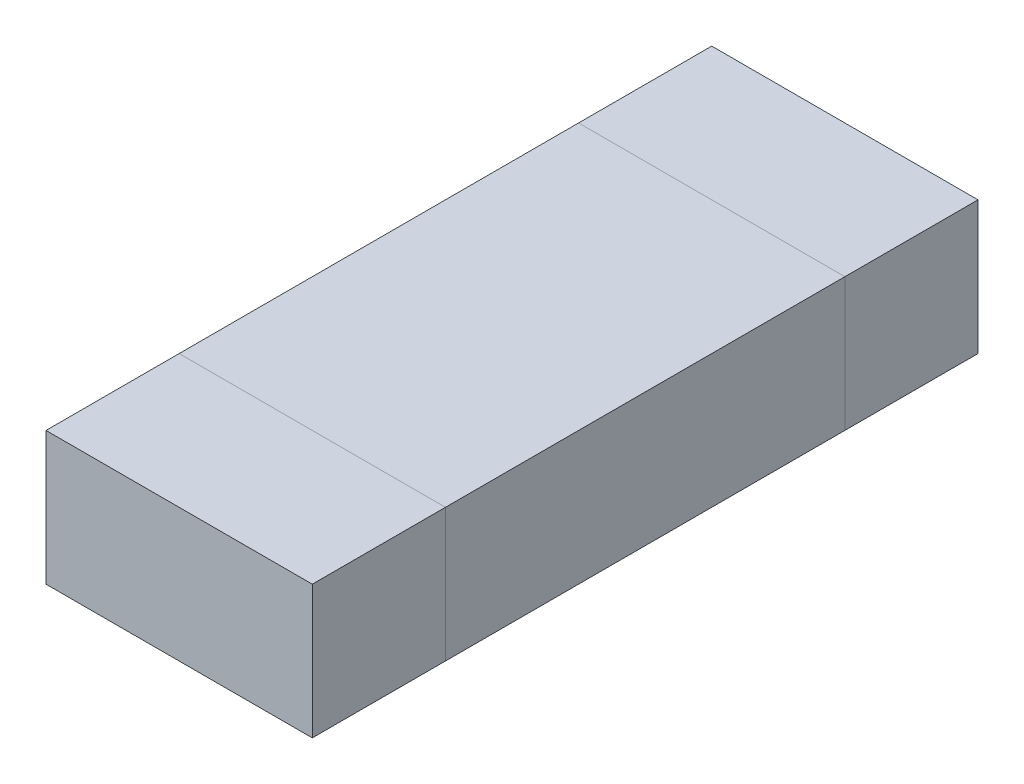
ISO-10303-21;
HEADER;
FILE_DESCRIPTION(('STEP AP214'),'2;1');
FILE_NAME('part.step','',(''),(''),'','','');
FILE_SCHEMA(('AUTOMOTIVE_DESIGN { 1 0 10303 214 1 1 1 1 }'));
ENDSEC;
DATA;
#1=APPLICATION_CONTEXT('core data for automotive mechanical design processes');
#2=APPLICATION_PROTOCOL_DEFINITION('international standard','automotive_design',2000,#1);
#3=PRODUCT_CONTEXT('',#1,'mechanical');
#4=PRODUCT('Part','Part','',(#3));
#5=PRODUCT_RELATED_PRODUCT_CATEGORY('part','',(#4));
#6=PRODUCT_DEFINITION_FORMATION('','',#4);
#7=PRODUCT_DEFINITION_CONTEXT('part definition',#1,'design');
#8=PRODUCT_DEFINITION('design','',#6,#7);
#9=PRODUCT_DEFINITION_SHAPE('','',#8);
#10=(LENGTH_UNIT() NAMED_UNIT(*) SI_UNIT(.MILLI.,.METRE.));
#11=(NAMED_UNIT(*) PLANE_ANGLE_UNIT() SI_UNIT($,.RADIAN.));
#12=(NAMED_UNIT(*) SI_UNIT($,.STERADIAN.) SOLID_ANGLE_UNIT());
#13=UNCERTAINTY_MEASURE_WITH_UNIT(LENGTH_MEASURE(1.E-05),#10,'distance_accuracy_value','');
#14=(GEOMETRIC_REPRESENTATION_CONTEXT(3) GLOBAL_UNCERTAINTY_ASSIGNED_CONTEXT((#13)) GLOBAL_UNIT_ASSIGNED_CONTEXT((#10,
#11,#12)) REPRESENTATION_CONTEXT('',''));
#15=CARTESIAN_POINT('',(0.,0.,0.));
#16=DIRECTION('',(0.,0.,1.));
#17=DIRECTION('',(1.,0.,0.));
#18=AXIS2_PLACEMENT_3D('',#15,#16,#17);
#19=CARTESIAN_POINT('',(0.4,0.4,-1.));
#20=DIRECTION('',(-1.,0.,0.));
#21=DIRECTION('',(0.,0.,1.));
#22=AXIS2_PLACEMENT_3D('',#19,#20,#21);
#23=PLANE('',#22);
#24=DIRECTION('',(0.,-1.,0.));
#25=VECTOR('',#24,1.);
#26=CARTESIAN_POINT('',(0.4,0.4,-0.6));
#27=LINE('',#26,#25);
#28=CARTESIAN_POINT('',(0.4,0.4,-0.6));
#29=VERTEX_POINT('',#28);
#30=CARTESIAN_POINT('',(0.4,0.,-0.6));
#31=VERTEX_POINT('',#30);
#32=EDGE_CURVE('E108',#29,#31,#27,.T.);
#33=ORIENTED_EDGE('',*,*,#32,.T.);
#34=DIRECTION('',(0.,0.,1.));
#35=VECTOR('',#34,1.);
#36=CARTESIAN_POINT('',(0.4,0.,-1.));
#37=LINE('',#36,#35);
#38=CARTESIAN_POINT('',(0.4,0.,-1.));
#39=VERTEX_POINT('',#38);
#40=EDGE_CURVE('E12',#39,#31,#37,.T.);
#41=ORIENTED_EDGE('',*,*,#40,.F.);
#42=DIRECTION('',(0.,-1.,0.));
#43=VECTOR('',#42,1.);
#44=CARTESIAN_POINT('',(0.4,0.4,-1.));
#45=LINE('',#44,#43);
#46=CARTESIAN_POINT('',(0.4,0.4,-1.));
#47=VERTEX_POINT('',#46);
#48=EDGE_CURVE('E96',#47,#39,#45,.T.);
#49=ORIENTED_EDGE('',*,*,#48,.F.);
#50=DIRECTION('',(0.,0.,1.));
#51=VECTOR('',#50,1.);
#52=CARTESIAN_POINT('',(0.4,0.4,-1.));
#53=LINE('',#52,#51);
#54=EDGE_CURVE('E104',#47,#29,#53,.T.);
#55=ORIENTED_EDGE('',*,*,#54,.T.);
#56=EDGE_LOOP('',(#33,#41,#49,#55));
#57=FACE_BOUND('',#56,.T.);
#58=ADVANCED_FACE('F45',(#57),#23,.F.);
#59=CARTESIAN_POINT('',(0.4,0.,-1.));
#60=DIRECTION('',(0.,1.,0.));
#61=DIRECTION('',(0.,0.,1.));
#62=AXIS2_PLACEMENT_3D('',#59,#60,#61);
#63=PLANE('',#62);
#64=DIRECTION('',(-1.,0.,0.));
#65=VECTOR('',#64,1.);
#66=CARTESIAN_POINT('',(0.4,0.,-0.6));
#67=LINE('',#66,#65);
#68=CARTESIAN_POINT('',(-0.4,0.,-0.6));
#69=VERTEX_POINT('',#68);
#70=EDGE_CURVE('E100',#31,#69,#67,.T.);
#71=ORIENTED_EDGE('',*,*,#70,.T.);
#72=DIRECTION('',(0.,0.,1.));
#73=VECTOR('',#72,1.);
#74=CARTESIAN_POINT('',(-0.4,0.,-1.));
#75=LINE('',#74,#73);
#76=CARTESIAN_POINT('',(-0.4,0.,-1.));
#77=VERTEX_POINT('',#76);
#78=EDGE_CURVE('E53',#77,#69,#75,.T.);
#79=ORIENTED_EDGE('',*,*,#78,.F.);
#80=DIRECTION('',(-1.,0.,0.));
#81=VECTOR('',#80,1.);
#82=CARTESIAN_POINT('',(0.4,0.,-1.));
#83=LINE('',#82,#81);
#84=EDGE_CURVE('E91',#39,#77,#83,.T.);
#85=ORIENTED_EDGE('',*,*,#84,.F.);
#86=ORIENTED_EDGE('',*,*,#40,.T.);
#87=EDGE_LOOP('',(#71,#79,#85,#86));
#88=FACE_BOUND('',#87,.T.);
#89=ADVANCED_FACE('F99',(#88),#63,.F.);
#90=CARTESIAN_POINT('',(-0.4,0.,-1.));
#91=DIRECTION('',(1.,0.,0.));
#92=DIRECTION('',(0.,0.,-1.));
#93=AXIS2_PLACEMENT_3D('',#90,#91,#92);
#94=PLANE('',#93);
#95=DIRECTION('',(0.,1.,0.));
#96=VECTOR('',#95,1.);
#97=CARTESIAN_POINT('',(-0.4,0.,-0.6));
#98=LINE('',#97,#96);
#99=CARTESIAN_POINT('',(-0.4,0.4,-0.6));
#100=VERTEX_POINT('',#99);
#101=EDGE_CURVE('E78',#69,#100,#98,.T.);
#102=ORIENTED_EDGE('',*,*,#101,.T.);
#103=DIRECTION('',(0.,0.,1.));
#104=VECTOR('',#103,1.);
#105=CARTESIAN_POINT('',(-0.4,0.4,-1.));
#106=LINE('',#105,#104);
#107=CARTESIAN_POINT('',(-0.4,0.4,-1.));
#108=VERTEX_POINT('',#107);
#109=EDGE_CURVE('E101',#108,#100,#106,.T.);
#110=ORIENTED_EDGE('',*,*,#109,.F.);
#111=DIRECTION('',(0.,1.,0.));
#112=VECTOR('',#111,1.);
#113=CARTESIAN_POINT('',(-0.4,0.,-1.));
#114=LINE('',#113,#112);
#115=EDGE_CURVE('E94',#77,#108,#114,.T.);
#116=ORIENTED_EDGE('',*,*,#115,.F.);
#117=ORIENTED_EDGE('',*,*,#78,.T.);
#118=EDGE_LOOP('',(#102,#110,#116,#117));
#119=FACE_BOUND('',#118,.T.);
#120=ADVANCED_FACE('F102',(#119),#94,.F.);
#121=CARTESIAN_POINT('',(-0.4,0.4,-1.));
#122=DIRECTION('',(0.,-1.,0.));
#123=DIRECTION('',(0.,0.,-1.));
#124=AXIS2_PLACEMENT_3D('',#121,#122,#123);
#125=PLANE('',#124);
#126=DIRECTION('',(1.,0.,0.));
#127=VECTOR('',#126,1.);
#128=CARTESIAN_POINT('',(-0.4,0.4,-0.6));
#129=LINE('',#128,#127);
#130=EDGE_CURVE('E84',#100,#29,#129,.T.);
#131=ORIENTED_EDGE('',*,*,#130,.T.);
#132=ORIENTED_EDGE('',*,*,#54,.F.);
#133=DIRECTION('',(1.,0.,0.));
#134=VECTOR('',#133,1.);
#135=CARTESIAN_POINT('',(-0.4,0.4,-1.));
#136=LINE('',#135,#134);
#137=EDGE_CURVE('E61',#108,#47,#136,.T.);
#138=ORIENTED_EDGE('',*,*,#137,.F.);
#139=ORIENTED_EDGE('',*,*,#109,.T.);
#140=EDGE_LOOP('',(#131,#132,#138,#139));
#141=FACE_BOUND('',#140,.T.);
#142=ADVANCED_FACE('F115',(#141),#125,.F.);
#143=CARTESIAN_POINT('',(0.,0.,-1.));
#144=DIRECTION('',(0.,0.,-1.));
#145=DIRECTION('',(-1.,0.,0.));
#146=AXIS2_PLACEMENT_3D('',#143,#144,#145);
#147=PLANE('',#146);
#148=ORIENTED_EDGE('',*,*,#48,.T.);
#149=ORIENTED_EDGE('',*,*,#84,.T.);
#150=ORIENTED_EDGE('',*,*,#115,.T.);
#151=ORIENTED_EDGE('',*,*,#137,.T.);
#152=EDGE_LOOP('',(#148,#149,#150,#151));
#153=FACE_BOUND('',#152,.T.);
#154=ADVANCED_FACE('F92',(#153),#147,.T.);
#155=CARTESIAN_POINT('',(0.,0.,-0.6));
#156=DIRECTION('',(0.,0.,-1.));
#157=DIRECTION('',(-1.,0.,0.));
#158=AXIS2_PLACEMENT_3D('',#155,#156,#157);
#159=PLANE('',#158);
#160=ORIENTED_EDGE('',*,*,#32,.F.);
#161=ORIENTED_EDGE('',*,*,#130,.F.);
#162=ORIENTED_EDGE('',*,*,#101,.F.);
#163=ORIENTED_EDGE('',*,*,#70,.F.);
#164=EDGE_LOOP('',(#160,#161,#162,#163));
#165=FACE_BOUND('',#164,.T.);
#166=ADVANCED_FACE('F118',(#165),#159,.F.);
#167=CLOSED_SHELL('',(#58,#89,#120,#142,#154,#166));
#168=MANIFOLD_SOLID_BREP('B2',#167);
#169=CARTESIAN_POINT('',(-0.4,0.4,1.));
#170=DIRECTION('',(1.,0.,0.));
#171=DIRECTION('',(0.,0.,-1.));
#172=AXIS2_PLACEMENT_3D('',#169,#170,#171);
#173=PLANE('',#172);
#174=DIRECTION('',(0.,-1.,0.));
#175=VECTOR('',#174,1.);
#176=CARTESIAN_POINT('',(-0.4,0.4,0.6));
#177=LINE('',#176,#175);
#178=CARTESIAN_POINT('',(-0.4,0.4,0.6));
#179=VERTEX_POINT('',#178);
#180=CARTESIAN_POINT('',(-0.4,0.,0.6));
#181=VERTEX_POINT('',#180);
#182=EDGE_CURVE('E240',#179,#181,#177,.T.);
#183=ORIENTED_EDGE('',*,*,#182,.T.);
#184=DIRECTION('',(0.,0.,-1.));
#185=VECTOR('',#184,1.);
#186=CARTESIAN_POINT('',(-0.4,0.,1.));
#187=LINE('',#186,#185);
#188=CARTESIAN_POINT('',(-0.4,0.,1.));
#189=VERTEX_POINT('',#188);
#190=EDGE_CURVE('E43',#189,#181,#187,.T.);
#191=ORIENTED_EDGE('',*,*,#190,.F.);
#192=DIRECTION('',(0.,-1.,0.));
#193=VECTOR('',#192,1.);
#194=CARTESIAN_POINT('',(-0.4,0.4,1.));
#195=LINE('',#194,#193);
#196=CARTESIAN_POINT('',(-0.4,0.4,1.));
#197=VERTEX_POINT('',#196);
#198=EDGE_CURVE('E228',#197,#189,#195,.T.);
#199=ORIENTED_EDGE('',*,*,#198,.F.);
#200=DIRECTION('',(0.,0.,-1.));
#201=VECTOR('',#200,1.);
#202=CARTESIAN_POINT('',(-0.4,0.4,1.));
#203=LINE('',#202,#201);
#204=EDGE_CURVE('E236',#197,#179,#203,.T.);
#205=ORIENTED_EDGE('',*,*,#204,.T.);
#206=EDGE_LOOP('',(#183,#191,#199,#205));
#207=FACE_BOUND('',#206,.T.);
#208=ADVANCED_FACE('F177',(#207),#173,.F.);
#209=CARTESIAN_POINT('',(-0.4,0.,1.));
#210=DIRECTION('',(0.,1.,0.));
#211=DIRECTION('',(0.,0.,1.));
#212=AXIS2_PLACEMENT_3D('',#209,#210,#211);
#213=PLANE('',#212);
#214=DIRECTION('',(1.,0.,0.));
#215=VECTOR('',#214,1.);
#216=CARTESIAN_POINT('',(-0.4,0.,0.6));
#217=LINE('',#216,#215);
#218=CARTESIAN_POINT('',(0.4,0.,0.6));
#219=VERTEX_POINT('',#218);
#220=EDGE_CURVE('E232',#181,#219,#217,.T.);
#221=ORIENTED_EDGE('',*,*,#220,.T.);
#222=DIRECTION('',(0.,0.,-1.));
#223=VECTOR('',#222,1.);
#224=CARTESIAN_POINT('',(0.4,0.,1.));
#225=LINE('',#224,#223);
#226=CARTESIAN_POINT('',(0.4,0.,1.));
#227=VERTEX_POINT('',#226);
#228=EDGE_CURVE('E185',#227,#219,#225,.T.);
#229=ORIENTED_EDGE('',*,*,#228,.F.);
#230=DIRECTION('',(1.,0.,0.));
#231=VECTOR('',#230,1.);
#232=CARTESIAN_POINT('',(-0.4,0.,1.));
#233=LINE('',#232,#231);
#234=EDGE_CURVE('E223',#189,#227,#233,.T.);
#235=ORIENTED_EDGE('',*,*,#234,.F.);
#236=ORIENTED_EDGE('',*,*,#190,.T.);
#237=EDGE_LOOP('',(#221,#229,#235,#236));
#238=FACE_BOUND('',#237,.T.);
#239=ADVANCED_FACE('F231',(#238),#213,.F.);
#240=CARTESIAN_POINT('',(0.4,0.,1.));
#241=DIRECTION('',(-1.,0.,0.));
#242=DIRECTION('',(0.,0.,1.));
#243=AXIS2_PLACEMENT_3D('',#240,#241,#242);
#244=PLANE('',#243);
#245=DIRECTION('',(0.,1.,0.));
#246=VECTOR('',#245,1.);
#247=CARTESIAN_POINT('',(0.4,0.,0.6));
#248=LINE('',#247,#246);
#249=CARTESIAN_POINT('',(0.4,0.4,0.6));
#250=VERTEX_POINT('',#249);
#251=EDGE_CURVE('E210',#219,#250,#248,.T.);
#252=ORIENTED_EDGE('',*,*,#251,.T.);
#253=DIRECTION('',(0.,0.,-1.));
#254=VECTOR('',#253,1.);
#255=CARTESIAN_POINT('',(0.4,0.4,1.));
#256=LINE('',#255,#254);
#257=CARTESIAN_POINT('',(0.4,0.4,1.));
#258=VERTEX_POINT('',#257);
#259=EDGE_CURVE('E233',#258,#250,#256,.T.);
#260=ORIENTED_EDGE('',*,*,#259,.F.);
#261=DIRECTION('',(0.,1.,0.));
#262=VECTOR('',#261,1.);
#263=CARTESIAN_POINT('',(0.4,0.,1.));
#264=LINE('',#263,#262);
#265=EDGE_CURVE('E226',#227,#258,#264,.T.);
#266=ORIENTED_EDGE('',*,*,#265,.F.);
#267=ORIENTED_EDGE('',*,*,#228,.T.);
#268=EDGE_LOOP('',(#252,#260,#266,#267));
#269=FACE_BOUND('',#268,.T.);
#270=ADVANCED_FACE('F234',(#269),#244,.F.);
#271=CARTESIAN_POINT('',(0.4,0.4,1.));
#272=DIRECTION('',(0.,-1.,0.));
#273=DIRECTION('',(0.,0.,-1.));
#274=AXIS2_PLACEMENT_3D('',#271,#272,#273);
#275=PLANE('',#274);
#276=DIRECTION('',(-1.,0.,0.));
#277=VECTOR('',#276,1.);
#278=CARTESIAN_POINT('',(0.4,0.4,0.6));
#279=LINE('',#278,#277);
#280=EDGE_CURVE('E216',#250,#179,#279,.T.);
#281=ORIENTED_EDGE('',*,*,#280,.T.);
#282=ORIENTED_EDGE('',*,*,#204,.F.);
#283=DIRECTION('',(-1.,0.,0.));
#284=VECTOR('',#283,1.);
#285=CARTESIAN_POINT('',(0.4,0.4,1.));
#286=LINE('',#285,#284);
#287=EDGE_CURVE('E193',#258,#197,#286,.T.);
#288=ORIENTED_EDGE('',*,*,#287,.F.);
#289=ORIENTED_EDGE('',*,*,#259,.T.);
#290=EDGE_LOOP('',(#281,#282,#288,#289));
#291=FACE_BOUND('',#290,.T.);
#292=ADVANCED_FACE('F247',(#291),#275,.F.);
#293=CARTESIAN_POINT('',(0.,0.,1.));
#294=DIRECTION('',(0.,0.,1.));
#295=DIRECTION('',(1.,0.,0.));
#296=AXIS2_PLACEMENT_3D('',#293,#294,#295);
#297=PLANE('',#296);
#298=ORIENTED_EDGE('',*,*,#198,.T.);
#299=ORIENTED_EDGE('',*,*,#234,.T.);
#300=ORIENTED_EDGE('',*,*,#265,.T.);
#301=ORIENTED_EDGE('',*,*,#287,.T.);
#302=EDGE_LOOP('',(#298,#299,#300,#301));
#303=FACE_BOUND('',#302,.T.);
#304=ADVANCED_FACE('F224',(#303),#297,.T.);
#305=CARTESIAN_POINT('',(0.,0.,0.6));
#306=DIRECTION('',(0.,0.,1.));
#307=DIRECTION('',(1.,0.,0.));
#308=AXIS2_PLACEMENT_3D('',#305,#306,#307);
#309=PLANE('',#308);
#310=ORIENTED_EDGE('',*,*,#182,.F.);
#311=ORIENTED_EDGE('',*,*,#280,.F.);
#312=ORIENTED_EDGE('',*,*,#251,.F.);
#313=ORIENTED_EDGE('',*,*,#220,.F.);
#314=EDGE_LOOP('',(#310,#311,#312,#313));
#315=FACE_BOUND('',#314,.T.);
#316=ADVANCED_FACE('F250',(#315),#309,.F.);
#317=CLOSED_SHELL('',(#208,#239,#270,#292,#304,#316));
#318=MANIFOLD_SOLID_BREP('B6',#317);
#319=CARTESIAN_POINT('',(0.4,0.4,-0.6));
#320=DIRECTION('',(-1.,0.,0.));
#321=DIRECTION('',(0.,0.,1.));
#322=AXIS2_PLACEMENT_3D('',#319,#320,#321);
#323=PLANE('',#322);
#324=DIRECTION('',(0.,0.,-1.));
#325=VECTOR('',#324,1.);
#326=CARTESIAN_POINT('',(0.4,0.,-0.6));
#327=LINE('',#326,#325);
#328=CARTESIAN_POINT('',(0.4,0.,0.6));
#329=VERTEX_POINT('',#328);
#330=CARTESIAN_POINT('',(0.4,0.,-0.6));
#331=VERTEX_POINT('',#330);
#332=EDGE_CURVE('E363',#329,#331,#327,.T.);
#333=ORIENTED_EDGE('',*,*,#332,.T.);
#334=DIRECTION('',(0.,-1.,0.));
#335=VECTOR('',#334,1.);
#336=CARTESIAN_POINT('',(0.4,0.4,-0.6));
#337=LINE('',#336,#335);
#338=CARTESIAN_POINT('',(0.4,0.4,-0.6));
#339=VERTEX_POINT('',#338);
#340=EDGE_CURVE('E175',#339,#331,#337,.T.);
#341=ORIENTED_EDGE('',*,*,#340,.F.);
#342=DIRECTION('',(0.,0.,-1.));
#343=VECTOR('',#342,1.);
#344=CARTESIAN_POINT('',(0.4,0.4,-0.6));
#345=LINE('',#344,#343);
#346=CARTESIAN_POINT('',(0.4,0.4,0.6));
#347=VERTEX_POINT('',#346);
#348=EDGE_CURVE('E351',#347,#339,#345,.T.);
#349=ORIENTED_EDGE('',*,*,#348,.F.);
#350=DIRECTION('',(0.,-1.,0.));
#351=VECTOR('',#350,1.);
#352=CARTESIAN_POINT('',(0.4,0.4,0.6));
#353=LINE('',#352,#351);
#354=EDGE_CURVE('E359',#347,#329,#353,.T.);
#355=ORIENTED_EDGE('',*,*,#354,.T.);
#356=EDGE_LOOP('',(#333,#341,#349,#355));
#357=FACE_BOUND('',#356,.T.);
#358=ADVANCED_FACE('F300',(#357),#323,.F.);
#359=CARTESIAN_POINT('',(-0.4,0.4,-0.6));
#360=DIRECTION('',(0.,0.,1.));
#361=DIRECTION('',(1.,0.,0.));
#362=AXIS2_PLACEMENT_3D('',#359,#360,#361);
#363=PLANE('',#362);
#364=DIRECTION('',(-1.,0.,0.));
#365=VECTOR('',#364,1.);
#366=CARTESIAN_POINT('',(-0.4,0.,-0.6));
#367=LINE('',#366,#365);
#368=CARTESIAN_POINT('',(-0.4,0.,-0.6));
#369=VERTEX_POINT('',#368);
#370=EDGE_CURVE('E355',#331,#369,#367,.T.);
#371=ORIENTED_EDGE('',*,*,#370,.T.);
#372=DIRECTION('',(0.,-1.,0.));
#373=VECTOR('',#372,1.);
#374=CARTESIAN_POINT('',(-0.4,0.4,-0.6));
#375=LINE('',#374,#373);
#376=CARTESIAN_POINT('',(-0.4,0.4,-0.6));
#377=VERTEX_POINT('',#376);
#378=EDGE_CURVE('E308',#377,#369,#375,.T.);
#379=ORIENTED_EDGE('',*,*,#378,.F.);
#380=DIRECTION('',(-1.,0.,0.));
#381=VECTOR('',#380,1.);
#382=CARTESIAN_POINT('',(-0.4,0.4,-0.6));
#383=LINE('',#382,#381);
#384=EDGE_CURVE('E346',#339,#377,#383,.T.);
#385=ORIENTED_EDGE('',*,*,#384,.F.);
#386=ORIENTED_EDGE('',*,*,#340,.T.);
#387=EDGE_LOOP('',(#371,#379,#385,#386));
#388=FACE_BOUND('',#387,.T.);
#389=ADVANCED_FACE('F354',(#388),#363,.F.);
#390=CARTESIAN_POINT('',(-0.4,0.4,-0.6));
#391=DIRECTION('',(1.,0.,0.));
#392=DIRECTION('',(0.,0.,-1.));
#393=AXIS2_PLACEMENT_3D('',#390,#391,#392);
#394=PLANE('',#393);
#395=DIRECTION('',(0.,0.,1.));
#396=VECTOR('',#395,1.);
#397=CARTESIAN_POINT('',(-0.4,0.,-0.6));
#398=LINE('',#397,#396);
#399=CARTESIAN_POINT('',(-0.4,0.,0.6));
#400=VERTEX_POINT('',#399);
#401=EDGE_CURVE('E333',#369,#400,#398,.T.);
#402=ORIENTED_EDGE('',*,*,#401,.T.);
#403=DIRECTION('',(0.,-1.,0.));
#404=VECTOR('',#403,1.);
#405=CARTESIAN_POINT('',(-0.4,0.4,0.6));
#406=LINE('',#405,#404);
#407=CARTESIAN_POINT('',(-0.4,0.4,0.6));
#408=VERTEX_POINT('',#407);
#409=EDGE_CURVE('E356',#408,#400,#406,.T.);
#410=ORIENTED_EDGE('',*,*,#409,.F.);
#411=DIRECTION('',(0.,0.,1.));
#412=VECTOR('',#411,1.);
#413=CARTESIAN_POINT('',(-0.4,0.4,-0.6));
#414=LINE('',#413,#412);
#415=EDGE_CURVE('E349',#377,#408,#414,.T.);
#416=ORIENTED_EDGE('',*,*,#415,.F.);
#417=ORIENTED_EDGE('',*,*,#378,.T.);
#418=EDGE_LOOP('',(#402,#410,#416,#417));
#419=FACE_BOUND('',#418,.T.);
#420=ADVANCED_FACE('F357',(#419),#394,.F.);
#421=CARTESIAN_POINT('',(-0.4,0.4,0.6));
#422=DIRECTION('',(0.,0.,-1.));
#423=DIRECTION('',(-1.,0.,0.));
#424=AXIS2_PLACEMENT_3D('',#421,#422,#423);
#425=PLANE('',#424);
#426=DIRECTION('',(1.,0.,0.));
#427=VECTOR('',#426,1.);
#428=CARTESIAN_POINT('',(-0.4,0.,0.6));
#429=LINE('',#428,#427);
#430=EDGE_CURVE('E339',#400,#329,#429,.T.);
#431=ORIENTED_EDGE('',*,*,#430,.T.);
#432=ORIENTED_EDGE('',*,*,#354,.F.);
#433=DIRECTION('',(1.,0.,0.));
#434=VECTOR('',#433,1.);
#435=CARTESIAN_POINT('',(-0.4,0.4,0.6));
#436=LINE('',#435,#434);
#437=EDGE_CURVE('E316',#408,#347,#436,.T.);
#438=ORIENTED_EDGE('',*,*,#437,.F.);
#439=ORIENTED_EDGE('',*,*,#409,.T.);
#440=EDGE_LOOP('',(#431,#432,#438,#439));
#441=FACE_BOUND('',#440,.T.);
#442=ADVANCED_FACE('F370',(#441),#425,.F.);
#443=CARTESIAN_POINT('',(0.,0.4,0.));
#444=DIRECTION('',(0.,1.,0.));
#445=DIRECTION('',(0.,0.,1.));
#446=AXIS2_PLACEMENT_3D('',#443,#444,#445);
#447=PLANE('',#446);
#448=ORIENTED_EDGE('',*,*,#348,.T.);
#449=ORIENTED_EDGE('',*,*,#384,.T.);
#450=ORIENTED_EDGE('',*,*,#415,.T.);
#451=ORIENTED_EDGE('',*,*,#437,.T.);
#452=EDGE_LOOP('',(#448,#449,#450,#451));
#453=FACE_BOUND('',#452,.T.);
#454=ADVANCED_FACE('F347',(#453),#447,.T.);
#455=CARTESIAN_POINT('',(0.,0.,0.));
#456=DIRECTION('',(0.,1.,0.));
#457=DIRECTION('',(0.,0.,1.));
#458=AXIS2_PLACEMENT_3D('',#455,#456,#457);
#459=PLANE('',#458);
#460=ORIENTED_EDGE('',*,*,#332,.F.);
#461=ORIENTED_EDGE('',*,*,#430,.F.);
#462=ORIENTED_EDGE('',*,*,#401,.F.);
#463=ORIENTED_EDGE('',*,*,#370,.F.);
#464=EDGE_LOOP('',(#460,#461,#462,#463));
#465=FACE_BOUND('',#464,.T.);
#466=ADVANCED_FACE('F373',(#465),#459,.F.);
#467=CLOSED_SHELL('',(#358,#389,#420,#442,#454,#466));
#468=MANIFOLD_SOLID_BREP('B37',#467);
#469=ADVANCED_BREP_SHAPE_REPRESENTATION('',(#18,#168,#318,#468),#14);
#470=SHAPE_DEFINITION_REPRESENTATION(#9,#469);
ENDSEC;
END-ISO-10303-21;
